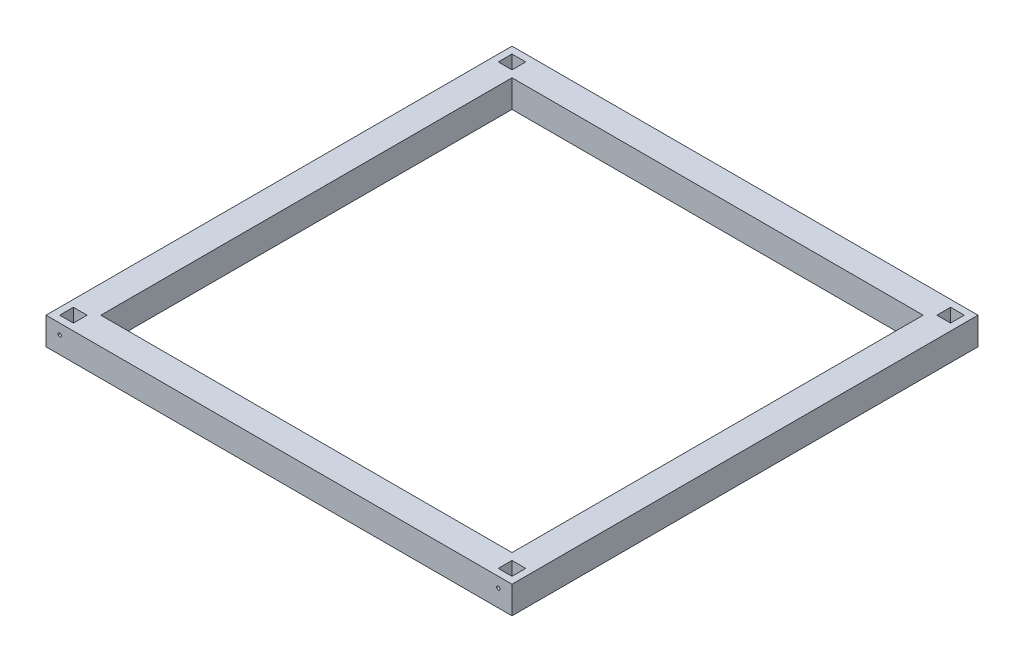
ISO-10303-21;
HEADER;
FILE_DESCRIPTION(('STEP AP214'),'2;1');
FILE_NAME('part.step','',(''),(''),'','','');
FILE_SCHEMA(('AUTOMOTIVE_DESIGN { 1 0 10303 214 1 1 1 1 }'));
ENDSEC;
DATA;
#1=APPLICATION_CONTEXT('core data for automotive mechanical design processes');
#2=APPLICATION_PROTOCOL_DEFINITION('international standard','automotive_design',2000,#1);
#3=PRODUCT_CONTEXT('',#1,'mechanical');
#4=PRODUCT('Part','Part','',(#3));
#5=PRODUCT_RELATED_PRODUCT_CATEGORY('part','',(#4));
#6=PRODUCT_DEFINITION_FORMATION('','',#4);
#7=PRODUCT_DEFINITION_CONTEXT('part definition',#1,'design');
#8=PRODUCT_DEFINITION('design','',#6,#7);
#9=PRODUCT_DEFINITION_SHAPE('','',#8);
#10=(LENGTH_UNIT() NAMED_UNIT(*) SI_UNIT(.MILLI.,.METRE.));
#11=(NAMED_UNIT(*) PLANE_ANGLE_UNIT() SI_UNIT($,.RADIAN.));
#12=(NAMED_UNIT(*) SI_UNIT($,.STERADIAN.) SOLID_ANGLE_UNIT());
#13=UNCERTAINTY_MEASURE_WITH_UNIT(LENGTH_MEASURE(1.E-05),#10,'distance_accuracy_value','');
#14=(GEOMETRIC_REPRESENTATION_CONTEXT(3) GLOBAL_UNCERTAINTY_ASSIGNED_CONTEXT((#13)) GLOBAL_UNIT_ASSIGNED_CONTEXT((#10,
#11,#12)) REPRESENTATION_CONTEXT('',''));
#15=CARTESIAN_POINT('',(0.,0.,0.));
#16=DIRECTION('',(0.,0.,1.));
#17=DIRECTION('',(1.,0.,0.));
#18=AXIS2_PLACEMENT_3D('',#15,#16,#17);
#19=CARTESIAN_POINT('',(0.,40.,0.));
#20=DIRECTION('',(0.,1.,0.));
#21=DIRECTION('',(0.,0.,1.));
#22=AXIS2_PLACEMENT_3D('',#19,#20,#21);
#23=PLANE('',#22);
#24=DIRECTION('',(0.,0.,-1.));
#25=VECTOR('',#24,1.);
#26=CARTESIAN_POINT('',(-310.027392848905,40.,310.));
#27=LINE('',#26,#25);
#28=CARTESIAN_POINT('',(-310.027392848905,40.,330.));
#29=VERTEX_POINT('',#28);
#30=CARTESIAN_POINT('',(-310.027392848905,40.,310.));
#31=VERTEX_POINT('',#30);
#32=EDGE_CURVE('E64',#29,#31,#27,.T.);
#33=ORIENTED_EDGE('',*,*,#32,.F.);
#34=DIRECTION('',(1.,0.,0.));
#35=VECTOR('',#34,1.);
#36=CARTESIAN_POINT('',(-330.027392848906,40.,330.));
#37=LINE('',#36,#35);
#38=CARTESIAN_POINT('',(-330.027392848906,40.,330.));
#39=VERTEX_POINT('',#38);
#40=EDGE_CURVE('E316',#39,#29,#37,.T.);
#41=ORIENTED_EDGE('',*,*,#40,.F.);
#42=DIRECTION('',(0.,0.,1.));
#43=VECTOR('',#42,1.);
#44=CARTESIAN_POINT('',(-330.027392848906,40.,310.));
#45=LINE('',#44,#43);
#46=CARTESIAN_POINT('',(-330.027392848906,40.,310.));
#47=VERTEX_POINT('',#46);
#48=EDGE_CURVE('E320',#47,#39,#45,.T.);
#49=ORIENTED_EDGE('',*,*,#48,.F.);
#50=DIRECTION('',(-1.,0.,0.));
#51=VECTOR('',#50,1.);
#52=CARTESIAN_POINT('',(-330.027392848906,40.,310.));
#53=LINE('',#52,#51);
#54=EDGE_CURVE('E325',#31,#47,#53,.T.);
#55=ORIENTED_EDGE('',*,*,#54,.F.);
#56=EDGE_LOOP('',(#33,#41,#49,#55));
#57=FACE_BOUND('',#56,.T.);
#58=DIRECTION('',(0.,0.,-1.));
#59=VECTOR('',#58,1.);
#60=CARTESIAN_POINT('',(329.972607151095,40.,310.));
#61=LINE('',#60,#59);
#62=CARTESIAN_POINT('',(329.972607151095,40.,330.));
#63=VERTEX_POINT('',#62);
#64=CARTESIAN_POINT('',(329.972607151095,40.,310.));
#65=VERTEX_POINT('',#64);
#66=EDGE_CURVE('E72',#63,#65,#61,.T.);
#67=ORIENTED_EDGE('',*,*,#66,.F.);
#68=DIRECTION('',(1.,0.,0.));
#69=VECTOR('',#68,1.);
#70=CARTESIAN_POINT('',(309.972607151095,40.,330.));
#71=LINE('',#70,#69);
#72=CARTESIAN_POINT('',(309.972607151095,40.,330.));
#73=VERTEX_POINT('',#72);
#74=EDGE_CURVE('E273',#73,#63,#71,.T.);
#75=ORIENTED_EDGE('',*,*,#74,.F.);
#76=DIRECTION('',(0.,0.,1.));
#77=VECTOR('',#76,1.);
#78=CARTESIAN_POINT('',(309.972607151095,40.,310.));
#79=LINE('',#78,#77);
#80=CARTESIAN_POINT('',(309.972607151095,40.,310.));
#81=VERTEX_POINT('',#80);
#82=EDGE_CURVE('E277',#81,#73,#79,.T.);
#83=ORIENTED_EDGE('',*,*,#82,.F.);
#84=DIRECTION('',(-1.,0.,0.));
#85=VECTOR('',#84,1.);
#86=CARTESIAN_POINT('',(309.972607151095,40.,310.));
#87=LINE('',#86,#85);
#88=EDGE_CURVE('E282',#65,#81,#87,.T.);
#89=ORIENTED_EDGE('',*,*,#88,.F.);
#90=EDGE_LOOP('',(#67,#75,#83,#89));
#91=FACE_BOUND('',#90,.T.);
#92=DIRECTION('',(0.,0.,-1.));
#93=VECTOR('',#92,1.);
#94=CARTESIAN_POINT('',(329.972607151088,40.,-330.));
#95=LINE('',#94,#93);
#96=CARTESIAN_POINT('',(329.972607151088,40.,-310.));
#97=VERTEX_POINT('',#96);
#98=CARTESIAN_POINT('',(329.972607151088,40.,-330.));
#99=VERTEX_POINT('',#98);
#100=EDGE_CURVE('E213',#97,#99,#95,.T.);
#101=ORIENTED_EDGE('',*,*,#100,.F.);
#102=DIRECTION('',(1.,0.,0.));
#103=VECTOR('',#102,1.);
#104=CARTESIAN_POINT('',(309.972607151088,40.,-310.));
#105=LINE('',#104,#103);
#106=CARTESIAN_POINT('',(309.972607151088,40.,-310.));
#107=VERTEX_POINT('',#106);
#108=EDGE_CURVE('E224',#107,#97,#105,.T.);
#109=ORIENTED_EDGE('',*,*,#108,.F.);
#110=DIRECTION('',(0.,0.,1.));
#111=VECTOR('',#110,1.);
#112=CARTESIAN_POINT('',(309.972607151088,40.,-330.));
#113=LINE('',#112,#111);
#114=CARTESIAN_POINT('',(309.972607151088,40.,-330.));
#115=VERTEX_POINT('',#114);
#116=EDGE_CURVE('E230',#115,#107,#113,.T.);
#117=ORIENTED_EDGE('',*,*,#116,.F.);
#118=DIRECTION('',(-1.,0.,0.));
#119=VECTOR('',#118,1.);
#120=CARTESIAN_POINT('',(309.972607151088,40.,-330.));
#121=LINE('',#120,#119);
#122=EDGE_CURVE('E235',#99,#115,#121,.T.);
#123=ORIENTED_EDGE('',*,*,#122,.F.);
#124=EDGE_LOOP('',(#101,#109,#117,#123));
#125=FACE_BOUND('',#124,.T.);
#126=DIRECTION('',(0.,0.,-1.));
#127=VECTOR('',#126,1.);
#128=CARTESIAN_POINT('',(-310.027392848912,40.,-330.));
#129=LINE('',#128,#127);
#130=CARTESIAN_POINT('',(-310.027392848912,40.,-310.));
#131=VERTEX_POINT('',#130);
#132=CARTESIAN_POINT('',(-310.027392848912,40.,-330.));
#133=VERTEX_POINT('',#132);
#134=EDGE_CURVE('E237',#131,#133,#129,.T.);
#135=ORIENTED_EDGE('',*,*,#134,.F.);
#136=DIRECTION('',(1.,0.,0.));
#137=VECTOR('',#136,1.);
#138=CARTESIAN_POINT('',(-330.027392848912,40.,-310.));
#139=LINE('',#138,#137);
#140=CARTESIAN_POINT('',(-330.027392848912,40.,-310.));
#141=VERTEX_POINT('',#140);
#142=EDGE_CURVE('E350',#141,#131,#139,.T.);
#143=ORIENTED_EDGE('',*,*,#142,.F.);
#144=DIRECTION('',(0.,0.,1.));
#145=VECTOR('',#144,1.);
#146=CARTESIAN_POINT('',(-330.027392848912,40.,-330.));
#147=LINE('',#146,#145);
#148=CARTESIAN_POINT('',(-330.027392848912,40.,-330.));
#149=VERTEX_POINT('',#148);
#150=EDGE_CURVE('E366',#149,#141,#147,.T.);
#151=ORIENTED_EDGE('',*,*,#150,.F.);
#152=DIRECTION('',(-1.,0.,0.));
#153=VECTOR('',#152,1.);
#154=CARTESIAN_POINT('',(-330.027392848912,40.,-330.));
#155=LINE('',#154,#153);
#156=EDGE_CURVE('E241',#133,#149,#155,.T.);
#157=ORIENTED_EDGE('',*,*,#156,.F.);
#158=EDGE_LOOP('',(#135,#143,#151,#157));
#159=FACE_BOUND('',#158,.T.);
#160=DIRECTION('',(0.,0.,1.));
#161=VECTOR('',#160,1.);
#162=CARTESIAN_POINT('',(-340.,40.,-340.));
#163=LINE('',#162,#161);
#164=CARTESIAN_POINT('',(-340.,40.,-340.));
#165=VERTEX_POINT('',#164);
#166=CARTESIAN_POINT('',(-340.,40.,340.));
#167=VERTEX_POINT('',#166);
#168=EDGE_CURVE('E429',#165,#167,#163,.T.);
#169=ORIENTED_EDGE('',*,*,#168,.T.);
#170=DIRECTION('',(1.,0.,0.));
#171=VECTOR('',#170,1.);
#172=CARTESIAN_POINT('',(-340.,40.,340.));
#173=LINE('',#172,#171);
#174=CARTESIAN_POINT('',(340.,40.,340.));
#175=VERTEX_POINT('',#174);
#176=EDGE_CURVE('E433',#167,#175,#173,.T.);
#177=ORIENTED_EDGE('',*,*,#176,.T.);
#178=DIRECTION('',(0.,0.,-1.));
#179=VECTOR('',#178,1.);
#180=CARTESIAN_POINT('',(340.,40.,-340.));
#181=LINE('',#180,#179);
#182=CARTESIAN_POINT('',(340.,40.,-340.));
#183=VERTEX_POINT('',#182);
#184=EDGE_CURVE('E437',#175,#183,#181,.T.);
#185=ORIENTED_EDGE('',*,*,#184,.T.);
#186=DIRECTION('',(-1.,0.,0.));
#187=VECTOR('',#186,1.);
#188=CARTESIAN_POINT('',(-340.,40.,-340.));
#189=LINE('',#188,#187);
#190=EDGE_CURVE('E440',#183,#165,#189,.T.);
#191=ORIENTED_EDGE('',*,*,#190,.T.);
#192=EDGE_LOOP('',(#169,#177,#185,#191));
#193=FACE_BOUND('',#192,.T.);
#194=DIRECTION('',(-1.,0.,0.));
#195=VECTOR('',#194,1.);
#196=CARTESIAN_POINT('',(-300.,40.,-300.));
#197=LINE('',#196,#195);
#198=CARTESIAN_POINT('',(300.,40.,-300.));
#199=VERTEX_POINT('',#198);
#200=CARTESIAN_POINT('',(-300.,40.,-300.));
#201=VERTEX_POINT('',#200);
#202=EDGE_CURVE('E389',#199,#201,#197,.T.);
#203=ORIENTED_EDGE('',*,*,#202,.F.);
#204=DIRECTION('',(0.,0.,-1.));
#205=VECTOR('',#204,1.);
#206=CARTESIAN_POINT('',(300.,40.,-300.));
#207=LINE('',#206,#205);
#208=CARTESIAN_POINT('',(300.,40.,300.));
#209=VERTEX_POINT('',#208);
#210=EDGE_CURVE('E386',#209,#199,#207,.T.);
#211=ORIENTED_EDGE('',*,*,#210,.F.);
#212=DIRECTION('',(1.,0.,0.));
#213=VECTOR('',#212,1.);
#214=CARTESIAN_POINT('',(-300.,40.,300.));
#215=LINE('',#214,#213);
#216=CARTESIAN_POINT('',(-300.,40.,300.));
#217=VERTEX_POINT('',#216);
#218=EDGE_CURVE('E397',#217,#209,#215,.T.);
#219=ORIENTED_EDGE('',*,*,#218,.F.);
#220=DIRECTION('',(0.,0.,1.));
#221=VECTOR('',#220,1.);
#222=CARTESIAN_POINT('',(-300.,40.,-300.));
#223=LINE('',#222,#221);
#224=EDGE_CURVE('E393',#201,#217,#223,.T.);
#225=ORIENTED_EDGE('',*,*,#224,.F.);
#226=EDGE_LOOP('',(#203,#211,#219,#225));
#227=FACE_BOUND('',#226,.T.);
#228=ADVANCED_FACE('F46',(#57,#91,#125,#159,#193,#227),#23,.T.);
#229=CARTESIAN_POINT('',(0.,0.,0.));
#230=DIRECTION('',(0.,1.,0.));
#231=DIRECTION('',(0.,0.,1.));
#232=AXIS2_PLACEMENT_3D('',#229,#230,#231);
#233=PLANE('',#232);
#234=DIRECTION('',(0.,0.,1.));
#235=VECTOR('',#234,1.);
#236=CARTESIAN_POINT('',(-340.,0.,-340.));
#237=LINE('',#236,#235);
#238=CARTESIAN_POINT('',(-340.,0.,-340.));
#239=VERTEX_POINT('',#238);
#240=CARTESIAN_POINT('',(-340.,0.,340.));
#241=VERTEX_POINT('',#240);
#242=EDGE_CURVE('E428',#239,#241,#237,.T.);
#243=ORIENTED_EDGE('',*,*,#242,.F.);
#244=DIRECTION('',(-1.,0.,0.));
#245=VECTOR('',#244,1.);
#246=CARTESIAN_POINT('',(-340.,0.,-340.));
#247=LINE('',#246,#245);
#248=CARTESIAN_POINT('',(340.,0.,-340.));
#249=VERTEX_POINT('',#248);
#250=EDGE_CURVE('E434',#249,#239,#247,.T.);
#251=ORIENTED_EDGE('',*,*,#250,.F.);
#252=DIRECTION('',(0.,0.,-1.));
#253=VECTOR('',#252,1.);
#254=CARTESIAN_POINT('',(340.,0.,-340.));
#255=LINE('',#254,#253);
#256=CARTESIAN_POINT('',(340.,0.,340.));
#257=VERTEX_POINT('',#256);
#258=EDGE_CURVE('E450',#257,#249,#255,.T.);
#259=ORIENTED_EDGE('',*,*,#258,.F.);
#260=DIRECTION('',(1.,0.,0.));
#261=VECTOR('',#260,1.);
#262=CARTESIAN_POINT('',(-340.,0.,340.));
#263=LINE('',#262,#261);
#264=EDGE_CURVE('E447',#241,#257,#263,.T.);
#265=ORIENTED_EDGE('',*,*,#264,.F.);
#266=EDGE_LOOP('',(#243,#251,#259,#265));
#267=FACE_BOUND('',#266,.T.);
#268=DIRECTION('',(0.,0.,-1.));
#269=VECTOR('',#268,1.);
#270=CARTESIAN_POINT('',(300.,0.,-300.));
#271=LINE('',#270,#269);
#272=CARTESIAN_POINT('',(300.,0.,300.));
#273=VERTEX_POINT('',#272);
#274=CARTESIAN_POINT('',(300.,0.,-300.));
#275=VERTEX_POINT('',#274);
#276=EDGE_CURVE('E376',#273,#275,#271,.T.);
#277=ORIENTED_EDGE('',*,*,#276,.T.);
#278=DIRECTION('',(-1.,0.,0.));
#279=VECTOR('',#278,1.);
#280=CARTESIAN_POINT('',(-300.,0.,-300.));
#281=LINE('',#280,#279);
#282=CARTESIAN_POINT('',(-300.,0.,-300.));
#283=VERTEX_POINT('',#282);
#284=EDGE_CURVE('E404',#275,#283,#281,.T.);
#285=ORIENTED_EDGE('',*,*,#284,.T.);
#286=DIRECTION('',(0.,0.,1.));
#287=VECTOR('',#286,1.);
#288=CARTESIAN_POINT('',(-300.,0.,-300.));
#289=LINE('',#288,#287);
#290=CARTESIAN_POINT('',(-300.,0.,300.));
#291=VERTEX_POINT('',#290);
#292=EDGE_CURVE('E408',#283,#291,#289,.T.);
#293=ORIENTED_EDGE('',*,*,#292,.T.);
#294=DIRECTION('',(1.,0.,0.));
#295=VECTOR('',#294,1.);
#296=CARTESIAN_POINT('',(-300.,0.,300.));
#297=LINE('',#296,#295);
#298=EDGE_CURVE('E390',#291,#273,#297,.T.);
#299=ORIENTED_EDGE('',*,*,#298,.T.);
#300=EDGE_LOOP('',(#277,#285,#293,#299));
#301=FACE_BOUND('',#300,.T.);
#302=ADVANCED_FACE('F556',(#267,#301),#233,.F.);
#303=CARTESIAN_POINT('',(-340.,40.,-340.));
#304=DIRECTION('',(1.,0.,0.));
#305=DIRECTION('',(0.,0.,-1.));
#306=AXIS2_PLACEMENT_3D('',#303,#304,#305);
#307=PLANE('',#306);
#308=ORIENTED_EDGE('',*,*,#242,.T.);
#309=DIRECTION('',(0.,-1.,0.));
#310=VECTOR('',#309,1.);
#311=CARTESIAN_POINT('',(-340.,40.,340.));
#312=LINE('',#311,#310);
#313=EDGE_CURVE('E11',#167,#241,#312,.T.);
#314=ORIENTED_EDGE('',*,*,#313,.F.);
#315=ORIENTED_EDGE('',*,*,#168,.F.);
#316=DIRECTION('',(0.,-1.,0.));
#317=VECTOR('',#316,1.);
#318=CARTESIAN_POINT('',(-340.,40.,-340.));
#319=LINE('',#318,#317);
#320=EDGE_CURVE('E443',#165,#239,#319,.T.);
#321=ORIENTED_EDGE('',*,*,#320,.T.);
#322=EDGE_LOOP('',(#308,#314,#315,#321));
#323=FACE_BOUND('',#322,.T.);
#324=ADVANCED_FACE('F48',(#323),#307,.F.);
#325=CARTESIAN_POINT('',(-340.,40.,340.));
#326=DIRECTION('',(0.,0.,-1.));
#327=DIRECTION('',(-1.,0.,0.));
#328=AXIS2_PLACEMENT_3D('',#325,#326,#327);
#329=PLANE('',#328);
#330=CARTESIAN_POINT('',(-320.,25.,340.));
#331=DIRECTION('',(0.,0.,1.));
#332=DIRECTION('',(1.,0.,0.));
#333=AXIS2_PLACEMENT_3D('',#330,#331,#332);
#334=CIRCLE('',#333,2.50000000000002);
#335=CARTESIAN_POINT('',(-317.5,25.,340.));
#336=VERTEX_POINT('',#335);
#337=EDGE_CURVE('E486',#336,#336,#334,.T.);
#338=ORIENTED_EDGE('',*,*,#337,.F.);
#339=EDGE_LOOP('',(#338));
#340=FACE_BOUND('',#339,.T.);
#341=CARTESIAN_POINT('',(320.,25.,340.));
#342=DIRECTION('',(0.,0.,1.));
#343=DIRECTION('',(1.,0.,0.));
#344=AXIS2_PLACEMENT_3D('',#341,#342,#343);
#345=CIRCLE('',#344,2.50000000000002);
#346=CARTESIAN_POINT('',(322.5,25.,340.));
#347=VERTEX_POINT('',#346);
#348=EDGE_CURVE('E492',#347,#347,#345,.T.);
#349=ORIENTED_EDGE('',*,*,#348,.F.);
#350=EDGE_LOOP('',(#349));
#351=FACE_BOUND('',#350,.T.);
#352=ORIENTED_EDGE('',*,*,#264,.T.);
#353=DIRECTION('',(0.,-1.,0.));
#354=VECTOR('',#353,1.);
#355=CARTESIAN_POINT('',(340.,40.,340.));
#356=LINE('',#355,#354);
#357=EDGE_CURVE('E56',#175,#257,#356,.T.);
#358=ORIENTED_EDGE('',*,*,#357,.F.);
#359=ORIENTED_EDGE('',*,*,#176,.F.);
#360=ORIENTED_EDGE('',*,*,#313,.T.);
#361=EDGE_LOOP('',(#352,#358,#359,#360));
#362=FACE_BOUND('',#361,.T.);
#363=ADVANCED_FACE('F575',(#340,#351,#362),#329,.F.);
#364=CARTESIAN_POINT('',(340.,40.,-340.));
#365=DIRECTION('',(-1.,0.,0.));
#366=DIRECTION('',(0.,0.,1.));
#367=AXIS2_PLACEMENT_3D('',#364,#365,#366);
#368=PLANE('',#367);
#369=ORIENTED_EDGE('',*,*,#258,.T.);
#370=DIRECTION('',(0.,-1.,0.));
#371=VECTOR('',#370,1.);
#372=CARTESIAN_POINT('',(340.,40.,-340.));
#373=LINE('',#372,#371);
#374=EDGE_CURVE('E458',#183,#249,#373,.T.);
#375=ORIENTED_EDGE('',*,*,#374,.F.);
#376=ORIENTED_EDGE('',*,*,#184,.F.);
#377=ORIENTED_EDGE('',*,*,#357,.T.);
#378=EDGE_LOOP('',(#369,#375,#376,#377));
#379=FACE_BOUND('',#378,.T.);
#380=ADVANCED_FACE('F572',(#379),#368,.F.);
#381=CARTESIAN_POINT('',(-340.,40.,-340.));
#382=DIRECTION('',(0.,0.,1.));
#383=DIRECTION('',(1.,0.,0.));
#384=AXIS2_PLACEMENT_3D('',#381,#382,#383);
#385=PLANE('',#384);
#386=CARTESIAN_POINT('',(-320.,25.,-340.));
#387=DIRECTION('',(0.,0.,-1.));
#388=DIRECTION('',(-1.,0.,0.));
#389=AXIS2_PLACEMENT_3D('',#386,#387,#388);
#390=CIRCLE('',#389,2.50000000000002);
#391=CARTESIAN_POINT('',(-322.5,25.,-340.));
#392=VERTEX_POINT('',#391);
#393=EDGE_CURVE('E510',#392,#392,#390,.T.);
#394=ORIENTED_EDGE('',*,*,#393,.F.);
#395=EDGE_LOOP('',(#394));
#396=FACE_BOUND('',#395,.T.);
#397=CARTESIAN_POINT('',(320.,24.9999999999955,-340.));
#398=DIRECTION('',(0.,0.,-1.));
#399=DIRECTION('',(-1.,0.,0.));
#400=AXIS2_PLACEMENT_3D('',#397,#398,#399);
#401=CIRCLE('',#400,2.50000000000002);
#402=CARTESIAN_POINT('',(317.5,24.9999999999955,-340.));
#403=VERTEX_POINT('',#402);
#404=EDGE_CURVE('E514',#403,#403,#401,.T.);
#405=ORIENTED_EDGE('',*,*,#404,.F.);
#406=EDGE_LOOP('',(#405));
#407=FACE_BOUND('',#406,.T.);
#408=ORIENTED_EDGE('',*,*,#250,.T.);
#409=ORIENTED_EDGE('',*,*,#320,.F.);
#410=ORIENTED_EDGE('',*,*,#190,.F.);
#411=ORIENTED_EDGE('',*,*,#374,.T.);
#412=EDGE_LOOP('',(#408,#409,#410,#411));
#413=FACE_BOUND('',#412,.T.);
#414=ADVANCED_FACE('F569',(#396,#407,#413),#385,.F.);
#415=CARTESIAN_POINT('',(300.,40.,-300.));
#416=DIRECTION('',(-1.,0.,0.));
#417=DIRECTION('',(0.,0.,1.));
#418=AXIS2_PLACEMENT_3D('',#415,#416,#417);
#419=PLANE('',#418);
#420=ORIENTED_EDGE('',*,*,#276,.F.);
#421=DIRECTION('',(0.,-1.,0.));
#422=VECTOR('',#421,1.);
#423=CARTESIAN_POINT('',(300.,40.,300.));
#424=LINE('',#423,#422);
#425=EDGE_CURVE('E400',#209,#273,#424,.T.);
#426=ORIENTED_EDGE('',*,*,#425,.F.);
#427=ORIENTED_EDGE('',*,*,#210,.T.);
#428=DIRECTION('',(0.,-1.,0.));
#429=VECTOR('',#428,1.);
#430=CARTESIAN_POINT('',(300.,40.,-300.));
#431=LINE('',#430,#429);
#432=EDGE_CURVE('E424',#199,#275,#431,.T.);
#433=ORIENTED_EDGE('',*,*,#432,.T.);
#434=EDGE_LOOP('',(#420,#426,#427,#433));
#435=FACE_BOUND('',#434,.T.);
#436=ADVANCED_FACE('F566',(#435),#419,.T.);
#437=CARTESIAN_POINT('',(-300.,40.,-300.));
#438=DIRECTION('',(0.,0.,1.));
#439=DIRECTION('',(1.,0.,0.));
#440=AXIS2_PLACEMENT_3D('',#437,#438,#439);
#441=PLANE('',#440);
#442=ORIENTED_EDGE('',*,*,#284,.F.);
#443=ORIENTED_EDGE('',*,*,#432,.F.);
#444=ORIENTED_EDGE('',*,*,#202,.T.);
#445=DIRECTION('',(0.,-1.,0.));
#446=VECTOR('',#445,1.);
#447=CARTESIAN_POINT('',(-300.,40.,-300.));
#448=LINE('',#447,#446);
#449=EDGE_CURVE('E421',#201,#283,#448,.T.);
#450=ORIENTED_EDGE('',*,*,#449,.T.);
#451=EDGE_LOOP('',(#442,#443,#444,#450));
#452=FACE_BOUND('',#451,.T.);
#453=ADVANCED_FACE('F610',(#452),#441,.T.);
#454=CARTESIAN_POINT('',(-300.,40.,-300.));
#455=DIRECTION('',(1.,0.,0.));
#456=DIRECTION('',(0.,0.,-1.));
#457=AXIS2_PLACEMENT_3D('',#454,#455,#456);
#458=PLANE('',#457);
#459=ORIENTED_EDGE('',*,*,#292,.F.);
#460=ORIENTED_EDGE('',*,*,#449,.F.);
#461=ORIENTED_EDGE('',*,*,#224,.T.);
#462=DIRECTION('',(0.,-1.,0.));
#463=VECTOR('',#462,1.);
#464=CARTESIAN_POINT('',(-300.,40.,300.));
#465=LINE('',#464,#463);
#466=EDGE_CURVE('E418',#217,#291,#465,.T.);
#467=ORIENTED_EDGE('',*,*,#466,.T.);
#468=EDGE_LOOP('',(#459,#460,#461,#467));
#469=FACE_BOUND('',#468,.T.);
#470=ADVANCED_FACE('F613',(#469),#458,.T.);
#471=CARTESIAN_POINT('',(-300.,40.,300.));
#472=DIRECTION('',(0.,0.,-1.));
#473=DIRECTION('',(-1.,0.,0.));
#474=AXIS2_PLACEMENT_3D('',#471,#472,#473);
#475=PLANE('',#474);
#476=ORIENTED_EDGE('',*,*,#298,.F.);
#477=ORIENTED_EDGE('',*,*,#466,.F.);
#478=ORIENTED_EDGE('',*,*,#218,.T.);
#479=ORIENTED_EDGE('',*,*,#425,.T.);
#480=EDGE_LOOP('',(#476,#477,#478,#479));
#481=FACE_BOUND('',#480,.T.);
#482=ADVANCED_FACE('F618',(#481),#475,.T.);
#483=CARTESIAN_POINT('',(-310.027392848912,10.,-330.));
#484=DIRECTION('',(1.,0.,0.));
#485=DIRECTION('',(0.,0.,-1.));
#486=AXIS2_PLACEMENT_3D('',#483,#484,#485);
#487=PLANE('',#486);
#488=ORIENTED_EDGE('',*,*,#134,.T.);
#489=DIRECTION('',(0.,1.,0.));
#490=VECTOR('',#489,1.);
#491=CARTESIAN_POINT('',(-310.027392848912,10.,-330.));
#492=LINE('',#491,#490);
#493=CARTESIAN_POINT('',(-310.027392848912,10.,-330.));
#494=VERTEX_POINT('',#493);
#495=EDGE_CURVE('E361',#494,#133,#492,.T.);
#496=ORIENTED_EDGE('',*,*,#495,.F.);
#497=DIRECTION('',(0.,0.,-1.));
#498=VECTOR('',#497,1.);
#499=CARTESIAN_POINT('',(-310.027392848912,10.,-330.));
#500=LINE('',#499,#498);
#501=CARTESIAN_POINT('',(-310.027392848912,10.,-310.));
#502=VERTEX_POINT('',#501);
#503=EDGE_CURVE('E345',#502,#494,#500,.T.);
#504=ORIENTED_EDGE('',*,*,#503,.F.);
#505=DIRECTION('',(0.,1.,0.));
#506=VECTOR('',#505,1.);
#507=CARTESIAN_POINT('',(-310.027392848912,10.,-310.));
#508=LINE('',#507,#506);
#509=EDGE_CURVE('E373',#502,#131,#508,.T.);
#510=ORIENTED_EDGE('',*,*,#509,.T.);
#511=EDGE_LOOP('',(#488,#496,#504,#510));
#512=FACE_BOUND('',#511,.T.);
#513=ADVANCED_FACE('F620',(#512),#487,.F.);
#514=CARTESIAN_POINT('',(-330.027392848912,10.,-310.));
#515=DIRECTION('',(0.,0.,1.));
#516=DIRECTION('',(1.,0.,0.));
#517=AXIS2_PLACEMENT_3D('',#514,#515,#516);
#518=PLANE('',#517);
#519=CARTESIAN_POINT('',(-320.,25.,-310.));
#520=DIRECTION('',(0.,0.,1.));
#521=DIRECTION('',(1.,0.,0.));
#522=AXIS2_PLACEMENT_3D('',#519,#520,#521);
#523=CIRCLE('',#522,2.50000000000002);
#524=CARTESIAN_POINT('',(-317.5,25.,-310.));
#525=VERTEX_POINT('',#524);
#526=EDGE_CURVE('E315',#525,#525,#523,.T.);
#527=ORIENTED_EDGE('',*,*,#526,.T.);
#528=EDGE_LOOP('',(#527));
#529=FACE_BOUND('',#528,.T.);
#530=ORIENTED_EDGE('',*,*,#142,.T.);
#531=ORIENTED_EDGE('',*,*,#509,.F.);
#532=DIRECTION('',(1.,0.,0.));
#533=VECTOR('',#532,1.);
#534=CARTESIAN_POINT('',(-330.027392848912,10.,-310.));
#535=LINE('',#534,#533);
#536=CARTESIAN_POINT('',(-330.027392848912,10.,-310.));
#537=VERTEX_POINT('',#536);
#538=EDGE_CURVE('E358',#537,#502,#535,.T.);
#539=ORIENTED_EDGE('',*,*,#538,.F.);
#540=DIRECTION('',(0.,1.,0.));
#541=VECTOR('',#540,1.);
#542=CARTESIAN_POINT('',(-330.027392848912,10.,-310.));
#543=LINE('',#542,#541);
#544=EDGE_CURVE('E377',#537,#141,#543,.T.);
#545=ORIENTED_EDGE('',*,*,#544,.T.);
#546=EDGE_LOOP('',(#530,#531,#539,#545));
#547=FACE_BOUND('',#546,.T.);
#548=ADVANCED_FACE('F626',(#529,#547),#518,.F.);
#549=CARTESIAN_POINT('',(-330.027392848912,10.,-330.));
#550=DIRECTION('',(-1.,0.,0.));
#551=DIRECTION('',(0.,0.,1.));
#552=AXIS2_PLACEMENT_3D('',#549,#550,#551);
#553=PLANE('',#552);
#554=ORIENTED_EDGE('',*,*,#150,.T.);
#555=ORIENTED_EDGE('',*,*,#544,.F.);
#556=DIRECTION('',(0.,0.,1.));
#557=VECTOR('',#556,1.);
#558=CARTESIAN_POINT('',(-330.027392848912,10.,-330.));
#559=LINE('',#558,#557);
#560=CARTESIAN_POINT('',(-330.027392848912,10.,-330.));
#561=VERTEX_POINT('',#560);
#562=EDGE_CURVE('E354',#561,#537,#559,.T.);
#563=ORIENTED_EDGE('',*,*,#562,.F.);
#564=DIRECTION('',(0.,1.,0.));
#565=VECTOR('',#564,1.);
#566=CARTESIAN_POINT('',(-330.027392848912,10.,-330.));
#567=LINE('',#566,#565);
#568=EDGE_CURVE('E380',#561,#149,#567,.T.);
#569=ORIENTED_EDGE('',*,*,#568,.T.);
#570=EDGE_LOOP('',(#554,#555,#563,#569));
#571=FACE_BOUND('',#570,.T.);
#572=ADVANCED_FACE('F713',(#571),#553,.F.);
#573=CARTESIAN_POINT('',(-330.027392848912,10.,-330.));
#574=DIRECTION('',(0.,0.,-1.));
#575=DIRECTION('',(-1.,0.,0.));
#576=AXIS2_PLACEMENT_3D('',#573,#574,#575);
#577=PLANE('',#576);
#578=CARTESIAN_POINT('',(-320.,25.,-330.));
#579=DIRECTION('',(0.,0.,-1.));
#580=DIRECTION('',(-1.,0.,0.));
#581=AXIS2_PLACEMENT_3D('',#578,#579,#580);
#582=CIRCLE('',#581,2.50000000000002);
#583=CARTESIAN_POINT('',(-322.5,25.,-330.));
#584=VERTEX_POINT('',#583);
#585=EDGE_CURVE('E471',#584,#584,#582,.T.);
#586=ORIENTED_EDGE('',*,*,#585,.T.);
#587=EDGE_LOOP('',(#586));
#588=FACE_BOUND('',#587,.T.);
#589=ORIENTED_EDGE('',*,*,#156,.T.);
#590=ORIENTED_EDGE('',*,*,#568,.F.);
#591=DIRECTION('',(-1.,0.,0.));
#592=VECTOR('',#591,1.);
#593=CARTESIAN_POINT('',(-330.027392848912,10.,-330.));
#594=LINE('',#593,#592);
#595=EDGE_CURVE('E349',#494,#561,#594,.T.);
#596=ORIENTED_EDGE('',*,*,#595,.F.);
#597=ORIENTED_EDGE('',*,*,#495,.T.);
#598=EDGE_LOOP('',(#589,#590,#596,#597));
#599=FACE_BOUND('',#598,.T.);
#600=ADVANCED_FACE('F723',(#588,#599),#577,.F.);
#601=CARTESIAN_POINT('',(0.,10.,0.));
#602=DIRECTION('',(0.,1.,0.));
#603=DIRECTION('',(0.,0.,1.));
#604=AXIS2_PLACEMENT_3D('',#601,#602,#603);
#605=PLANE('',#604);
#606=ORIENTED_EDGE('',*,*,#503,.T.);
#607=ORIENTED_EDGE('',*,*,#595,.T.);
#608=ORIENTED_EDGE('',*,*,#562,.T.);
#609=ORIENTED_EDGE('',*,*,#538,.T.);
#610=EDGE_LOOP('',(#606,#607,#608,#609));
#611=FACE_BOUND('',#610,.T.);
#612=ADVANCED_FACE('F733',(#611),#605,.T.);
#613=CARTESIAN_POINT('',(329.972607151088,10.,-330.));
#614=DIRECTION('',(1.,0.,0.));
#615=DIRECTION('',(0.,0.,-1.));
#616=AXIS2_PLACEMENT_3D('',#613,#614,#615);
#617=PLANE('',#616);
#618=ORIENTED_EDGE('',*,*,#100,.T.);
#619=DIRECTION('',(0.,1.,0.));
#620=VECTOR('',#619,1.);
#621=CARTESIAN_POINT('',(329.972607151088,10.,-330.));
#622=LINE('',#621,#620);
#623=CARTESIAN_POINT('',(329.972607151088,10.,-330.));
#624=VERTEX_POINT('',#623);
#625=EDGE_CURVE('E250',#624,#99,#622,.T.);
#626=ORIENTED_EDGE('',*,*,#625,.F.);
#627=DIRECTION('',(0.,0.,-1.));
#628=VECTOR('',#627,1.);
#629=CARTESIAN_POINT('',(329.972607151088,10.,-330.));
#630=LINE('',#629,#628);
#631=CARTESIAN_POINT('',(329.972607151088,10.,-310.));
#632=VERTEX_POINT('',#631);
#633=EDGE_CURVE('E216',#632,#624,#630,.T.);
#634=ORIENTED_EDGE('',*,*,#633,.F.);
#635=DIRECTION('',(0.,1.,0.));
#636=VECTOR('',#635,1.);
#637=CARTESIAN_POINT('',(329.972607151088,10.,-310.));
#638=LINE('',#637,#636);
#639=EDGE_CURVE('E209',#632,#97,#638,.T.);
#640=ORIENTED_EDGE('',*,*,#639,.T.);
#641=EDGE_LOOP('',(#618,#626,#634,#640));
#642=FACE_BOUND('',#641,.T.);
#643=ADVANCED_FACE('F211',(#642),#617,.F.);
#644=CARTESIAN_POINT('',(309.972607151088,10.,-310.));
#645=DIRECTION('',(0.,0.,1.));
#646=DIRECTION('',(1.,0.,0.));
#647=AXIS2_PLACEMENT_3D('',#644,#645,#646);
#648=PLANE('',#647);
#649=CARTESIAN_POINT('',(320.,24.9999999999955,-310.));
#650=DIRECTION('',(0.,0.,1.));
#651=DIRECTION('',(1.,0.,0.));
#652=AXIS2_PLACEMENT_3D('',#649,#650,#651);
#653=CIRCLE('',#652,2.50000000000002);
#654=CARTESIAN_POINT('',(322.5,24.9999999999955,-310.));
#655=VERTEX_POINT('',#654);
#656=EDGE_CURVE('E469',#655,#655,#653,.T.);
#657=ORIENTED_EDGE('',*,*,#656,.T.);
#658=EDGE_LOOP('',(#657));
#659=FACE_BOUND('',#658,.T.);
#660=ORIENTED_EDGE('',*,*,#108,.T.);
#661=ORIENTED_EDGE('',*,*,#639,.F.);
#662=DIRECTION('',(1.,0.,0.));
#663=VECTOR('',#662,1.);
#664=CARTESIAN_POINT('',(309.972607151088,10.,-310.));
#665=LINE('',#664,#663);
#666=CARTESIAN_POINT('',(309.972607151088,10.,-310.));
#667=VERTEX_POINT('',#666);
#668=EDGE_CURVE('E246',#667,#632,#665,.T.);
#669=ORIENTED_EDGE('',*,*,#668,.F.);
#670=DIRECTION('',(0.,1.,0.));
#671=VECTOR('',#670,1.);
#672=CARTESIAN_POINT('',(309.972607151088,10.,-310.));
#673=LINE('',#672,#671);
#674=EDGE_CURVE('E221',#667,#107,#673,.T.);
#675=ORIENTED_EDGE('',*,*,#674,.T.);
#676=EDGE_LOOP('',(#660,#661,#669,#675));
#677=FACE_BOUND('',#676,.T.);
#678=ADVANCED_FACE('F225',(#659,#677),#648,.F.);
#679=CARTESIAN_POINT('',(309.972607151088,10.,-330.));
#680=DIRECTION('',(-1.,0.,0.));
#681=DIRECTION('',(0.,0.,1.));
#682=AXIS2_PLACEMENT_3D('',#679,#680,#681);
#683=PLANE('',#682);
#684=ORIENTED_EDGE('',*,*,#116,.T.);
#685=ORIENTED_EDGE('',*,*,#674,.F.);
#686=DIRECTION('',(0.,0.,1.));
#687=VECTOR('',#686,1.);
#688=CARTESIAN_POINT('',(309.972607151088,10.,-330.));
#689=LINE('',#688,#687);
#690=CARTESIAN_POINT('',(309.972607151088,10.,-330.));
#691=VERTEX_POINT('',#690);
#692=EDGE_CURVE('E249',#691,#667,#689,.T.);
#693=ORIENTED_EDGE('',*,*,#692,.F.);
#694=DIRECTION('',(0.,1.,0.));
#695=VECTOR('',#694,1.);
#696=CARTESIAN_POINT('',(309.972607151088,10.,-330.));
#697=LINE('',#696,#695);
#698=EDGE_CURVE('E529',#691,#115,#697,.T.);
#699=ORIENTED_EDGE('',*,*,#698,.T.);
#700=EDGE_LOOP('',(#684,#685,#693,#699));
#701=FACE_BOUND('',#700,.T.);
#702=ADVANCED_FACE('F535',(#701),#683,.F.);
#703=CARTESIAN_POINT('',(309.972607151088,10.,-330.));
#704=DIRECTION('',(0.,0.,-1.));
#705=DIRECTION('',(-1.,0.,0.));
#706=AXIS2_PLACEMENT_3D('',#703,#704,#705);
#707=PLANE('',#706);
#708=CARTESIAN_POINT('',(320.,24.9999999999955,-330.));
#709=DIRECTION('',(0.,0.,-1.));
#710=DIRECTION('',(-1.,0.,0.));
#711=AXIS2_PLACEMENT_3D('',#708,#709,#710);
#712=CIRCLE('',#711,2.50000000000002);
#713=CARTESIAN_POINT('',(317.5,24.9999999999955,-330.));
#714=VERTEX_POINT('',#713);
#715=EDGE_CURVE('E465',#714,#714,#712,.T.);
#716=ORIENTED_EDGE('',*,*,#715,.T.);
#717=EDGE_LOOP('',(#716));
#718=FACE_BOUND('',#717,.T.);
#719=ORIENTED_EDGE('',*,*,#122,.T.);
#720=ORIENTED_EDGE('',*,*,#698,.F.);
#721=DIRECTION('',(-1.,0.,0.));
#722=VECTOR('',#721,1.);
#723=CARTESIAN_POINT('',(309.972607151088,10.,-330.));
#724=LINE('',#723,#722);
#725=EDGE_CURVE('E254',#624,#691,#724,.T.);
#726=ORIENTED_EDGE('',*,*,#725,.F.);
#727=ORIENTED_EDGE('',*,*,#625,.T.);
#728=EDGE_LOOP('',(#719,#720,#726,#727));
#729=FACE_BOUND('',#728,.T.);
#730=ADVANCED_FACE('F539',(#718,#729),#707,.F.);
#731=CARTESIAN_POINT('',(0.,10.,0.));
#732=DIRECTION('',(0.,1.,0.));
#733=DIRECTION('',(0.,0.,1.));
#734=AXIS2_PLACEMENT_3D('',#731,#732,#733);
#735=PLANE('',#734);
#736=ORIENTED_EDGE('',*,*,#633,.T.);
#737=ORIENTED_EDGE('',*,*,#725,.T.);
#738=ORIENTED_EDGE('',*,*,#692,.T.);
#739=ORIENTED_EDGE('',*,*,#668,.T.);
#740=EDGE_LOOP('',(#736,#737,#738,#739));
#741=FACE_BOUND('',#740,.T.);
#742=ADVANCED_FACE('F541',(#741),#735,.T.);
#743=CARTESIAN_POINT('',(329.972607151095,10.,310.));
#744=DIRECTION('',(1.,0.,0.));
#745=DIRECTION('',(0.,0.,-1.));
#746=AXIS2_PLACEMENT_3D('',#743,#744,#745);
#747=PLANE('',#746);
#748=ORIENTED_EDGE('',*,*,#66,.T.);
#749=DIRECTION('',(0.,1.,0.));
#750=VECTOR('',#749,1.);
#751=CARTESIAN_POINT('',(329.972607151095,10.,310.));
#752=LINE('',#751,#750);
#753=CARTESIAN_POINT('',(329.972607151095,10.,310.));
#754=VERTEX_POINT('',#753);
#755=EDGE_CURVE('E260',#754,#65,#752,.T.);
#756=ORIENTED_EDGE('',*,*,#755,.F.);
#757=DIRECTION('',(0.,0.,-1.));
#758=VECTOR('',#757,1.);
#759=CARTESIAN_POINT('',(329.972607151095,10.,310.));
#760=LINE('',#759,#758);
#761=CARTESIAN_POINT('',(329.972607151095,10.,330.));
#762=VERTEX_POINT('',#761);
#763=EDGE_CURVE('E278',#762,#754,#760,.T.);
#764=ORIENTED_EDGE('',*,*,#763,.F.);
#765=DIRECTION('',(0.,1.,0.));
#766=VECTOR('',#765,1.);
#767=CARTESIAN_POINT('',(329.972607151095,10.,330.));
#768=LINE('',#767,#766);
#769=EDGE_CURVE('E270',#762,#63,#768,.T.);
#770=ORIENTED_EDGE('',*,*,#769,.T.);
#771=EDGE_LOOP('',(#748,#756,#764,#770));
#772=FACE_BOUND('',#771,.T.);
#773=ADVANCED_FACE('F543',(#772),#747,.F.);
#774=CARTESIAN_POINT('',(309.972607151095,10.,330.));
#775=DIRECTION('',(0.,0.,1.));
#776=DIRECTION('',(1.,0.,0.));
#777=AXIS2_PLACEMENT_3D('',#774,#775,#776);
#778=PLANE('',#777);
#779=CARTESIAN_POINT('',(320.,25.,330.));
#780=DIRECTION('',(0.,0.,1.));
#781=DIRECTION('',(1.,0.,0.));
#782=AXIS2_PLACEMENT_3D('',#779,#780,#781);
#783=CIRCLE('',#782,2.50000000000002);
#784=CARTESIAN_POINT('',(322.5,25.,330.));
#785=VERTEX_POINT('',#784);
#786=EDGE_CURVE('E502',#785,#785,#783,.T.);
#787=ORIENTED_EDGE('',*,*,#786,.T.);
#788=EDGE_LOOP('',(#787));
#789=FACE_BOUND('',#788,.T.);
#790=ORIENTED_EDGE('',*,*,#74,.T.);
#791=ORIENTED_EDGE('',*,*,#769,.F.);
#792=DIRECTION('',(1.,0.,0.));
#793=VECTOR('',#792,1.);
#794=CARTESIAN_POINT('',(309.972607151095,10.,330.));
#795=LINE('',#794,#793);
#796=CARTESIAN_POINT('',(309.972607151095,10.,330.));
#797=VERTEX_POINT('',#796);
#798=EDGE_CURVE('E263',#797,#762,#795,.T.);
#799=ORIENTED_EDGE('',*,*,#798,.F.);
#800=DIRECTION('',(0.,1.,0.));
#801=VECTOR('',#800,1.);
#802=CARTESIAN_POINT('',(309.972607151095,10.,330.));
#803=LINE('',#802,#801);
#804=EDGE_CURVE('E267',#797,#73,#803,.T.);
#805=ORIENTED_EDGE('',*,*,#804,.T.);
#806=EDGE_LOOP('',(#790,#791,#799,#805));
#807=FACE_BOUND('',#806,.T.);
#808=ADVANCED_FACE('F549',(#789,#807),#778,.F.);
#809=CARTESIAN_POINT('',(309.972607151095,10.,310.));
#810=DIRECTION('',(-1.,0.,0.));
#811=DIRECTION('',(0.,0.,1.));
#812=AXIS2_PLACEMENT_3D('',#809,#810,#811);
#813=PLANE('',#812);
#814=ORIENTED_EDGE('',*,*,#82,.T.);
#815=ORIENTED_EDGE('',*,*,#804,.F.);
#816=DIRECTION('',(0.,0.,1.));
#817=VECTOR('',#816,1.);
#818=CARTESIAN_POINT('',(309.972607151095,10.,310.));
#819=LINE('',#818,#817);
#820=CARTESIAN_POINT('',(309.972607151095,10.,310.));
#821=VERTEX_POINT('',#820);
#822=EDGE_CURVE('E291',#821,#797,#819,.T.);
#823=ORIENTED_EDGE('',*,*,#822,.F.);
#824=DIRECTION('',(0.,1.,0.));
#825=VECTOR('',#824,1.);
#826=CARTESIAN_POINT('',(309.972607151095,10.,310.));
#827=LINE('',#826,#825);
#828=EDGE_CURVE('E264',#821,#81,#827,.T.);
#829=ORIENTED_EDGE('',*,*,#828,.T.);
#830=EDGE_LOOP('',(#814,#815,#823,#829));
#831=FACE_BOUND('',#830,.T.);
#832=ADVANCED_FACE('F790',(#831),#813,.F.);
#833=CARTESIAN_POINT('',(309.972607151095,10.,310.));
#834=DIRECTION('',(0.,0.,-1.));
#835=DIRECTION('',(-1.,0.,0.));
#836=AXIS2_PLACEMENT_3D('',#833,#834,#835);
#837=PLANE('',#836);
#838=CARTESIAN_POINT('',(320.,25.,310.));
#839=DIRECTION('',(0.,0.,-1.));
#840=DIRECTION('',(-1.,0.,0.));
#841=AXIS2_PLACEMENT_3D('',#838,#839,#840);
#842=CIRCLE('',#841,2.50000000000002);
#843=CARTESIAN_POINT('',(317.5,25.,310.));
#844=VERTEX_POINT('',#843);
#845=EDGE_CURVE('E50',#844,#844,#842,.T.);
#846=ORIENTED_EDGE('',*,*,#845,.T.);
#847=EDGE_LOOP('',(#846));
#848=FACE_BOUND('',#847,.T.);
#849=ORIENTED_EDGE('',*,*,#88,.T.);
#850=ORIENTED_EDGE('',*,*,#828,.F.);
#851=DIRECTION('',(-1.,0.,0.));
#852=VECTOR('',#851,1.);
#853=CARTESIAN_POINT('',(309.972607151095,10.,310.));
#854=LINE('',#853,#852);
#855=EDGE_CURVE('E295',#754,#821,#854,.T.);
#856=ORIENTED_EDGE('',*,*,#855,.F.);
#857=ORIENTED_EDGE('',*,*,#755,.T.);
#858=EDGE_LOOP('',(#849,#850,#856,#857));
#859=FACE_BOUND('',#858,.T.);
#860=ADVANCED_FACE('F800',(#848,#859),#837,.F.);
#861=CARTESIAN_POINT('',(0.,10.,0.));
#862=DIRECTION('',(0.,1.,0.));
#863=DIRECTION('',(0.,0.,1.));
#864=AXIS2_PLACEMENT_3D('',#861,#862,#863);
#865=PLANE('',#864);
#866=ORIENTED_EDGE('',*,*,#763,.T.);
#867=ORIENTED_EDGE('',*,*,#855,.T.);
#868=ORIENTED_EDGE('',*,*,#822,.T.);
#869=ORIENTED_EDGE('',*,*,#798,.T.);
#870=EDGE_LOOP('',(#866,#867,#868,#869));
#871=FACE_BOUND('',#870,.T.);
#872=ADVANCED_FACE('F810',(#871),#865,.T.);
#873=CARTESIAN_POINT('',(-310.027392848905,10.,310.));
#874=DIRECTION('',(1.,0.,0.));
#875=DIRECTION('',(0.,0.,-1.));
#876=AXIS2_PLACEMENT_3D('',#873,#874,#875);
#877=PLANE('',#876);
#878=ORIENTED_EDGE('',*,*,#32,.T.);
#879=DIRECTION('',(0.,1.,0.));
#880=VECTOR('',#879,1.);
#881=CARTESIAN_POINT('',(-310.027392848905,10.,310.));
#882=LINE('',#881,#880);
#883=CARTESIAN_POINT('',(-310.027392848905,10.,310.));
#884=VERTEX_POINT('',#883);
#885=EDGE_CURVE('E302',#884,#31,#882,.T.);
#886=ORIENTED_EDGE('',*,*,#885,.F.);
#887=DIRECTION('',(0.,0.,-1.));
#888=VECTOR('',#887,1.);
#889=CARTESIAN_POINT('',(-310.027392848905,10.,310.));
#890=LINE('',#889,#888);
#891=CARTESIAN_POINT('',(-310.027392848905,10.,330.));
#892=VERTEX_POINT('',#891);
#893=EDGE_CURVE('E321',#892,#884,#890,.T.);
#894=ORIENTED_EDGE('',*,*,#893,.F.);
#895=DIRECTION('',(0.,1.,0.));
#896=VECTOR('',#895,1.);
#897=CARTESIAN_POINT('',(-310.027392848905,10.,330.));
#898=LINE('',#897,#896);
#899=EDGE_CURVE('E312',#892,#29,#898,.T.);
#900=ORIENTED_EDGE('',*,*,#899,.T.);
#901=EDGE_LOOP('',(#878,#886,#894,#900));
#902=FACE_BOUND('',#901,.T.);
#903=ADVANCED_FACE('F820',(#902),#877,.F.);
#904=CARTESIAN_POINT('',(-330.027392848906,10.,330.));
#905=DIRECTION('',(0.,0.,1.));
#906=DIRECTION('',(1.,0.,0.));
#907=AXIS2_PLACEMENT_3D('',#904,#905,#906);
#908=PLANE('',#907);
#909=CARTESIAN_POINT('',(-320.,25.,330.));
#910=DIRECTION('',(0.,0.,1.));
#911=DIRECTION('',(1.,0.,0.));
#912=AXIS2_PLACEMENT_3D('',#909,#910,#911);
#913=CIRCLE('',#912,2.50000000000002);
#914=CARTESIAN_POINT('',(-317.5,25.,330.));
#915=VERTEX_POINT('',#914);
#916=EDGE_CURVE('E477',#915,#915,#913,.T.);
#917=ORIENTED_EDGE('',*,*,#916,.T.);
#918=EDGE_LOOP('',(#917));
#919=FACE_BOUND('',#918,.T.);
#920=ORIENTED_EDGE('',*,*,#40,.T.);
#921=ORIENTED_EDGE('',*,*,#899,.F.);
#922=DIRECTION('',(1.,0.,0.));
#923=VECTOR('',#922,1.);
#924=CARTESIAN_POINT('',(-330.027392848906,10.,330.));
#925=LINE('',#924,#923);
#926=CARTESIAN_POINT('',(-330.027392848906,10.,330.));
#927=VERTEX_POINT('',#926);
#928=EDGE_CURVE('E305',#927,#892,#925,.T.);
#929=ORIENTED_EDGE('',*,*,#928,.F.);
#930=DIRECTION('',(0.,1.,0.));
#931=VECTOR('',#930,1.);
#932=CARTESIAN_POINT('',(-330.027392848906,10.,330.));
#933=LINE('',#932,#931);
#934=EDGE_CURVE('E309',#927,#39,#933,.T.);
#935=ORIENTED_EDGE('',*,*,#934,.T.);
#936=EDGE_LOOP('',(#920,#921,#929,#935));
#937=FACE_BOUND('',#936,.T.);
#938=ADVANCED_FACE('F830',(#919,#937),#908,.F.);
#939=CARTESIAN_POINT('',(-330.027392848906,10.,310.));
#940=DIRECTION('',(-1.,0.,0.));
#941=DIRECTION('',(0.,0.,1.));
#942=AXIS2_PLACEMENT_3D('',#939,#940,#941);
#943=PLANE('',#942);
#944=ORIENTED_EDGE('',*,*,#48,.T.);
#945=ORIENTED_EDGE('',*,*,#934,.F.);
#946=DIRECTION('',(0.,0.,1.));
#947=VECTOR('',#946,1.);
#948=CARTESIAN_POINT('',(-330.027392848906,10.,310.));
#949=LINE('',#948,#947);
#950=CARTESIAN_POINT('',(-330.027392848906,10.,310.));
#951=VERTEX_POINT('',#950);
#952=EDGE_CURVE('E334',#951,#927,#949,.T.);
#953=ORIENTED_EDGE('',*,*,#952,.F.);
#954=DIRECTION('',(0.,1.,0.));
#955=VECTOR('',#954,1.);
#956=CARTESIAN_POINT('',(-330.027392848906,10.,310.));
#957=LINE('',#956,#955);
#958=EDGE_CURVE('E306',#951,#47,#957,.T.);
#959=ORIENTED_EDGE('',*,*,#958,.T.);
#960=EDGE_LOOP('',(#944,#945,#953,#959));
#961=FACE_BOUND('',#960,.T.);
#962=ADVANCED_FACE('F839',(#961),#943,.F.);
#963=CARTESIAN_POINT('',(-330.027392848906,10.,310.));
#964=DIRECTION('',(0.,0.,-1.));
#965=DIRECTION('',(-1.,0.,0.));
#966=AXIS2_PLACEMENT_3D('',#963,#964,#965);
#967=PLANE('',#966);
#968=CARTESIAN_POINT('',(-320.,25.,310.));
#969=DIRECTION('',(0.,0.,-1.));
#970=DIRECTION('',(-1.,0.,0.));
#971=AXIS2_PLACEMENT_3D('',#968,#969,#970);
#972=CIRCLE('',#971,2.50000000000002);
#973=CARTESIAN_POINT('',(-322.5,25.,310.));
#974=VERTEX_POINT('',#973);
#975=EDGE_CURVE('E474',#974,#974,#972,.T.);
#976=ORIENTED_EDGE('',*,*,#975,.T.);
#977=EDGE_LOOP('',(#976));
#978=FACE_BOUND('',#977,.T.);
#979=ORIENTED_EDGE('',*,*,#54,.T.);
#980=ORIENTED_EDGE('',*,*,#958,.F.);
#981=DIRECTION('',(-1.,0.,0.));
#982=VECTOR('',#981,1.);
#983=CARTESIAN_POINT('',(-330.027392848906,10.,310.));
#984=LINE('',#983,#982);
#985=EDGE_CURVE('E338',#884,#951,#984,.T.);
#986=ORIENTED_EDGE('',*,*,#985,.F.);
#987=ORIENTED_EDGE('',*,*,#885,.T.);
#988=EDGE_LOOP('',(#979,#980,#986,#987));
#989=FACE_BOUND('',#988,.T.);
#990=ADVANCED_FACE('F849',(#978,#989),#967,.F.);
#991=CARTESIAN_POINT('',(0.,10.,0.));
#992=DIRECTION('',(0.,1.,0.));
#993=DIRECTION('',(0.,0.,1.));
#994=AXIS2_PLACEMENT_3D('',#991,#992,#993);
#995=PLANE('',#994);
#996=ORIENTED_EDGE('',*,*,#893,.T.);
#997=ORIENTED_EDGE('',*,*,#985,.T.);
#998=ORIENTED_EDGE('',*,*,#952,.T.);
#999=ORIENTED_EDGE('',*,*,#928,.T.);
#1000=EDGE_LOOP('',(#996,#997,#998,#999));
#1001=FACE_BOUND('',#1000,.T.);
#1002=ADVANCED_FACE('F859',(#1001),#995,.T.);
#1003=CARTESIAN_POINT('',(320.,24.9999999999955,-300.));
#1004=DIRECTION('',(0.,0.,-1.));
#1005=DIRECTION('',(-1.,0.,0.));
#1006=AXIS2_PLACEMENT_3D('',#1003,#1004,#1005);
#1007=CYLINDRICAL_SURFACE('',#1006,2.50000000000002);
#1008=ORIENTED_EDGE('',*,*,#404,.T.);
#1009=EDGE_LOOP('',(#1008));
#1010=FACE_BOUND('',#1009,.T.);
#1011=ORIENTED_EDGE('',*,*,#715,.F.);
#1012=EDGE_LOOP('',(#1011));
#1013=FACE_BOUND('',#1012,.T.);
#1014=ADVANCED_FACE('F868',(#1010,#1013),#1007,.F.);
#1015=CARTESIAN_POINT('',(320.,24.9999999999955,-300.));
#1016=DIRECTION('',(0.,0.,-1.));
#1017=DIRECTION('',(-1.,0.,0.));
#1018=AXIS2_PLACEMENT_3D('',#1015,#1016,#1017);
#1019=CIRCLE('',#1018,2.50000000000002);
#1020=CARTESIAN_POINT('',(317.5,24.9999999999955,-300.));
#1021=VERTEX_POINT('',#1020);
#1022=EDGE_CURVE('E506',#1021,#1021,#1019,.T.);
#1023=ORIENTED_EDGE('',*,*,#1022,.F.);
#1024=EDGE_LOOP('',(#1023));
#1025=FACE_BOUND('',#1024,.T.);
#1026=ORIENTED_EDGE('',*,*,#656,.F.);
#1027=EDGE_LOOP('',(#1026));
#1028=FACE_BOUND('',#1027,.T.);
#1029=ADVANCED_FACE('F877',(#1025,#1028),#1007,.F.);
#1030=CARTESIAN_POINT('',(320.,24.9999999999955,-300.));
#1031=DIRECTION('',(0.,0.,-1.));
#1032=DIRECTION('',(-1.,0.,0.));
#1033=AXIS2_PLACEMENT_3D('',#1030,#1031,#1032);
#1034=PLANE('',#1033);
#1035=ORIENTED_EDGE('',*,*,#1022,.T.);
#1036=EDGE_LOOP('',(#1035));
#1037=FACE_BOUND('',#1036,.T.);
#1038=ADVANCED_FACE('F887',(#1037),#1034,.T.);
#1039=CARTESIAN_POINT('',(-320.,25.,-300.));
#1040=DIRECTION('',(0.,0.,-1.));
#1041=DIRECTION('',(-1.,0.,0.));
#1042=AXIS2_PLACEMENT_3D('',#1039,#1040,#1041);
#1043=CYLINDRICAL_SURFACE('',#1042,2.50000000000002);
#1044=ORIENTED_EDGE('',*,*,#393,.T.);
#1045=EDGE_LOOP('',(#1044));
#1046=FACE_BOUND('',#1045,.T.);
#1047=ORIENTED_EDGE('',*,*,#585,.F.);
#1048=EDGE_LOOP('',(#1047));
#1049=FACE_BOUND('',#1048,.T.);
#1050=ADVANCED_FACE('F896',(#1046,#1049),#1043,.F.);
#1051=CARTESIAN_POINT('',(-320.,25.,-300.));
#1052=DIRECTION('',(0.,0.,-1.));
#1053=DIRECTION('',(-1.,0.,0.));
#1054=AXIS2_PLACEMENT_3D('',#1051,#1052,#1053);
#1055=CIRCLE('',#1054,2.50000000000002);
#1056=CARTESIAN_POINT('',(-322.5,25.,-300.));
#1057=VERTEX_POINT('',#1056);
#1058=EDGE_CURVE('E470',#1057,#1057,#1055,.T.);
#1059=ORIENTED_EDGE('',*,*,#1058,.F.);
#1060=EDGE_LOOP('',(#1059));
#1061=FACE_BOUND('',#1060,.T.);
#1062=ORIENTED_EDGE('',*,*,#526,.F.);
#1063=EDGE_LOOP('',(#1062));
#1064=FACE_BOUND('',#1063,.T.);
#1065=ADVANCED_FACE('F906',(#1061,#1064),#1043,.F.);
#1066=CARTESIAN_POINT('',(-320.,25.,-300.));
#1067=DIRECTION('',(0.,0.,-1.));
#1068=DIRECTION('',(-1.,0.,0.));
#1069=AXIS2_PLACEMENT_3D('',#1066,#1067,#1068);
#1070=PLANE('',#1069);
#1071=ORIENTED_EDGE('',*,*,#1058,.T.);
#1072=EDGE_LOOP('',(#1071));
#1073=FACE_BOUND('',#1072,.T.);
#1074=ADVANCED_FACE('F916',(#1073),#1070,.T.);
#1075=CARTESIAN_POINT('',(-320.,25.,300.));
#1076=DIRECTION('',(0.,0.,1.));
#1077=DIRECTION('',(1.,0.,0.));
#1078=AXIS2_PLACEMENT_3D('',#1075,#1076,#1077);
#1079=PLANE('',#1078);
#1080=CARTESIAN_POINT('',(-320.,25.,300.));
#1081=DIRECTION('',(0.,0.,1.));
#1082=DIRECTION('',(1.,0.,0.));
#1083=AXIS2_PLACEMENT_3D('',#1080,#1081,#1082);
#1084=CIRCLE('',#1083,2.50000000000002);
#1085=CARTESIAN_POINT('',(-317.5,25.,300.));
#1086=VERTEX_POINT('',#1085);
#1087=EDGE_CURVE('E478',#1086,#1086,#1084,.T.);
#1088=ORIENTED_EDGE('',*,*,#1087,.T.);
#1089=EDGE_LOOP('',(#1088));
#1090=FACE_BOUND('',#1089,.T.);
#1091=ADVANCED_FACE('F925',(#1090),#1079,.T.);
#1092=CARTESIAN_POINT('',(-320.,25.,300.));
#1093=DIRECTION('',(0.,0.,1.));
#1094=DIRECTION('',(1.,0.,0.));
#1095=AXIS2_PLACEMENT_3D('',#1092,#1093,#1094);
#1096=CYLINDRICAL_SURFACE('',#1095,2.50000000000002);
#1097=ORIENTED_EDGE('',*,*,#1087,.F.);
#1098=EDGE_LOOP('',(#1097));
#1099=FACE_BOUND('',#1098,.T.);
#1100=ORIENTED_EDGE('',*,*,#975,.F.);
#1101=EDGE_LOOP('',(#1100));
#1102=FACE_BOUND('',#1101,.T.);
#1103=ADVANCED_FACE('F934',(#1099,#1102),#1096,.F.);
#1104=ORIENTED_EDGE('',*,*,#337,.T.);
#1105=EDGE_LOOP('',(#1104));
#1106=FACE_BOUND('',#1105,.T.);
#1107=ORIENTED_EDGE('',*,*,#916,.F.);
#1108=EDGE_LOOP('',(#1107));
#1109=FACE_BOUND('',#1108,.T.);
#1110=ADVANCED_FACE('F943',(#1106,#1109),#1096,.F.);
#1111=CARTESIAN_POINT('',(320.,25.,300.));
#1112=DIRECTION('',(0.,0.,1.));
#1113=DIRECTION('',(1.,0.,0.));
#1114=AXIS2_PLACEMENT_3D('',#1111,#1112,#1113);
#1115=PLANE('',#1114);
#1116=CARTESIAN_POINT('',(320.,25.,300.));
#1117=DIRECTION('',(0.,0.,1.));
#1118=DIRECTION('',(1.,0.,0.));
#1119=AXIS2_PLACEMENT_3D('',#1116,#1117,#1118);
#1120=CIRCLE('',#1119,2.50000000000002);
#1121=CARTESIAN_POINT('',(322.5,25.,300.));
#1122=VERTEX_POINT('',#1121);
#1123=EDGE_CURVE('E498',#1122,#1122,#1120,.T.);
#1124=ORIENTED_EDGE('',*,*,#1123,.T.);
#1125=EDGE_LOOP('',(#1124));
#1126=FACE_BOUND('',#1125,.T.);
#1127=ADVANCED_FACE('F953',(#1126),#1115,.T.);
#1128=CARTESIAN_POINT('',(320.,25.,300.));
#1129=DIRECTION('',(0.,0.,1.));
#1130=DIRECTION('',(1.,0.,0.));
#1131=AXIS2_PLACEMENT_3D('',#1128,#1129,#1130);
#1132=CYLINDRICAL_SURFACE('',#1131,2.50000000000002);
#1133=ORIENTED_EDGE('',*,*,#1123,.F.);
#1134=EDGE_LOOP('',(#1133));
#1135=FACE_BOUND('',#1134,.T.);
#1136=ORIENTED_EDGE('',*,*,#845,.F.);
#1137=EDGE_LOOP('',(#1136));
#1138=FACE_BOUND('',#1137,.T.);
#1139=ADVANCED_FACE('F962',(#1135,#1138),#1132,.F.);
#1140=ORIENTED_EDGE('',*,*,#348,.T.);
#1141=EDGE_LOOP('',(#1140));
#1142=FACE_BOUND('',#1141,.T.);
#1143=ORIENTED_EDGE('',*,*,#786,.F.);
#1144=EDGE_LOOP('',(#1143));
#1145=FACE_BOUND('',#1144,.T.);
#1146=ADVANCED_FACE('F972',(#1142,#1145),#1132,.F.);
#1147=CLOSED_SHELL('',(#228,#302,#324,#363,#380,#414,#436,#453,#470,#482,#513,#548,#572,#600,
#612,#643,#678,#702,#730,#742,#773,#808,#832,#860,#872,#903,#938,#962,#990,#1002,#1014,#1029,
#1038,#1050,#1065,#1074,#1091,#1103,#1110,#1127,#1139,#1146));
#1148=MANIFOLD_SOLID_BREP('B2',#1147);
#1149=ADVANCED_BREP_SHAPE_REPRESENTATION('',(#18,#1148),#14);
#1150=SHAPE_DEFINITION_REPRESENTATION(#9,#1149);
ENDSEC;
END-ISO-10303-21;
